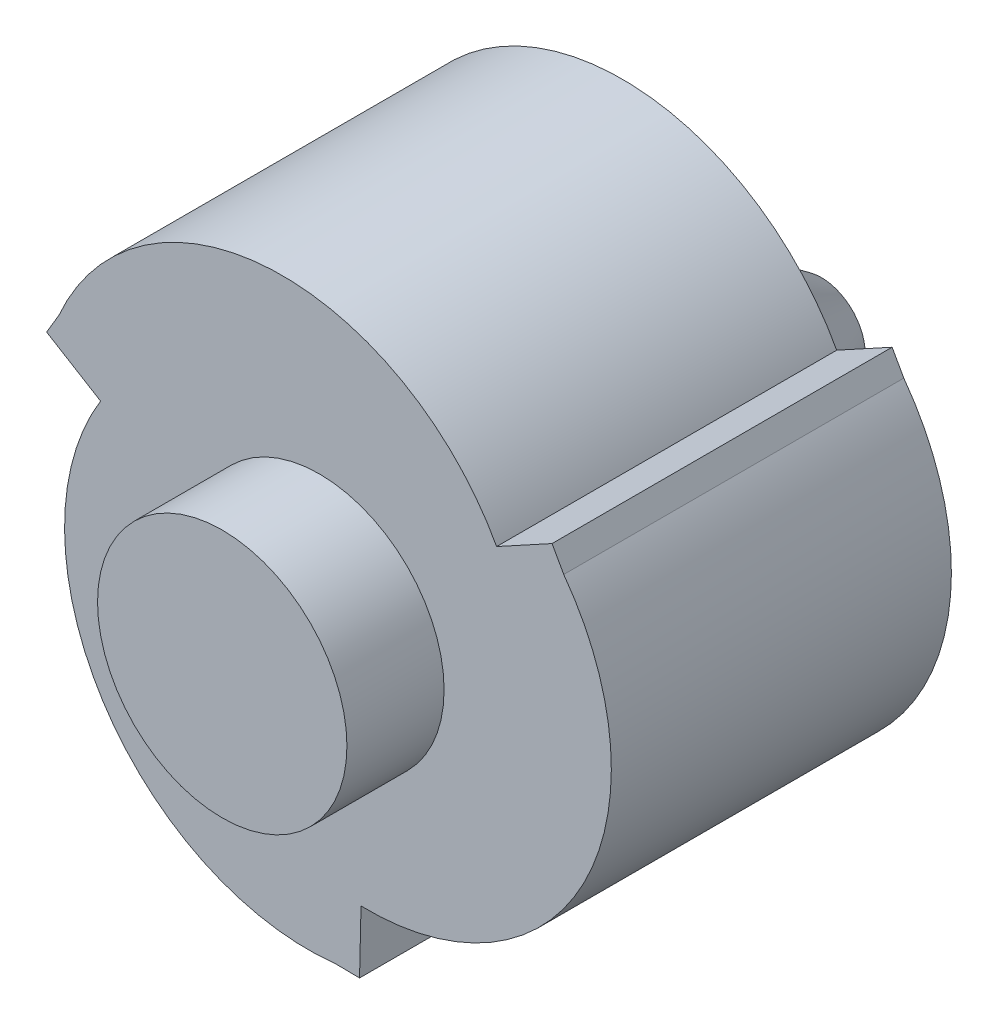
ISO-10303-21;
HEADER;
FILE_DESCRIPTION(('STEP AP214'),'2;1');
FILE_NAME('part.step','',(''),(''),'','','');
FILE_SCHEMA(('AUTOMOTIVE_DESIGN { 1 0 10303 214 1 1 1 1 }'));
ENDSEC;
DATA;
#1=APPLICATION_CONTEXT('core data for automotive mechanical design processes');
#2=APPLICATION_PROTOCOL_DEFINITION('international standard','automotive_design',2000,#1);
#3=PRODUCT_CONTEXT('',#1,'mechanical');
#4=PRODUCT('Part','Part','',(#3));
#5=PRODUCT_RELATED_PRODUCT_CATEGORY('part','',(#4));
#6=PRODUCT_DEFINITION_FORMATION('','',#4);
#7=PRODUCT_DEFINITION_CONTEXT('part definition',#1,'design');
#8=PRODUCT_DEFINITION('design','',#6,#7);
#9=PRODUCT_DEFINITION_SHAPE('','',#8);
#10=(LENGTH_UNIT() NAMED_UNIT(*) SI_UNIT(.MILLI.,.METRE.));
#11=(NAMED_UNIT(*) PLANE_ANGLE_UNIT() SI_UNIT($,.RADIAN.));
#12=(NAMED_UNIT(*) SI_UNIT($,.STERADIAN.) SOLID_ANGLE_UNIT());
#13=UNCERTAINTY_MEASURE_WITH_UNIT(LENGTH_MEASURE(1.E-05),#10,'distance_accuracy_value','');
#14=(GEOMETRIC_REPRESENTATION_CONTEXT(3) GLOBAL_UNCERTAINTY_ASSIGNED_CONTEXT((#13)) GLOBAL_UNIT_ASSIGNED_CONTEXT((#10,
#11,#12)) REPRESENTATION_CONTEXT('',''));
#15=CARTESIAN_POINT('',(0.,0.,0.));
#16=DIRECTION('',(0.,0.,1.));
#17=DIRECTION('',(1.,0.,0.));
#18=AXIS2_PLACEMENT_3D('',#15,#16,#17);
#19=CARTESIAN_POINT('',(-70.3006140847829,18.6401092386416,18.));
#20=DIRECTION('',(0.,0.,-1.));
#21=DIRECTION('',(-1.,0.,0.));
#22=AXIS2_PLACEMENT_3D('',#19,#20,#21);
#23=CYLINDRICAL_SURFACE('',#22,13.5393656771925);
#24=CARTESIAN_POINT('',(-70.3006140847829,18.6401092386416,0.));
#25=DIRECTION('',(0.,0.,1.));
#26=DIRECTION('',(-1.,0.,0.));
#27=AXIS2_PLACEMENT_3D('',#24,#25,#26);
#28=CIRCLE('',#27,13.5393656771925);
#29=CARTESIAN_POINT('',(-80.9495335990785,27.001624419444,0.));
#30=VERTEX_POINT('',#29);
#31=CARTESIAN_POINT('',(-69.6242160517726,5.11764982322154,0.));
#32=VERTEX_POINT('',#31);
#33=EDGE_CURVE('E196',#30,#32,#28,.T.);
#34=ORIENTED_EDGE('',*,*,#33,.F.);
#35=DIRECTION('',(0.,0.,-1.));
#36=VECTOR('',#35,1.);
#37=CARTESIAN_POINT('',(-80.9495335990785,27.001624419444,18.));
#38=LINE('',#37,#36);
#39=CARTESIAN_POINT('',(-80.9495335990785,27.001624419444,18.));
#40=VERTEX_POINT('',#39);
#41=EDGE_CURVE('E115',#40,#30,#38,.T.);
#42=ORIENTED_EDGE('',*,*,#41,.F.);
#43=CARTESIAN_POINT('',(-70.3006140847829,18.6401092386416,18.));
#44=DIRECTION('',(0.,0.,1.));
#45=DIRECTION('',(-1.,0.,0.));
#46=AXIS2_PLACEMENT_3D('',#43,#44,#45);
#47=CIRCLE('',#46,13.5393656771925);
#48=CARTESIAN_POINT('',(-69.6242160517726,5.11764982322154,18.));
#49=VERTEX_POINT('',#48);
#50=EDGE_CURVE('E49',#40,#49,#47,.T.);
#51=ORIENTED_EDGE('',*,*,#50,.T.);
#52=DIRECTION('',(0.,0.,-1.));
#53=VECTOR('',#52,1.);
#54=CARTESIAN_POINT('',(-69.6242160517726,5.11764982322154,18.));
#55=LINE('',#54,#53);
#56=EDGE_CURVE('E129',#49,#32,#55,.T.);
#57=ORIENTED_EDGE('',*,*,#56,.T.);
#58=EDGE_LOOP('',(#34,#42,#51,#57));
#59=FACE_BOUND('',#58,.T.);
#60=ADVANCED_FACE('F33',(#59),#23,.F.);
#61=CARTESIAN_POINT('',(-69.6242160517726,5.11764982322154,18.));
#62=DIRECTION('',(0.,1.,0.));
#63=DIRECTION('',(0.,0.,1.));
#64=AXIS2_PLACEMENT_3D('',#61,#62,#63);
#65=PLANE('',#64);
#66=DIRECTION('',(1.,0.,0.));
#67=VECTOR('',#66,1.);
#68=CARTESIAN_POINT('',(-69.6242160517726,5.11764982322154,0.));
#69=LINE('',#68,#67);
#70=CARTESIAN_POINT('',(-68.6242160517726,5.11764982322154,0.));
#71=VERTEX_POINT('',#70);
#72=EDGE_CURVE('E218',#32,#71,#69,.T.);
#73=ORIENTED_EDGE('',*,*,#72,.F.);
#74=ORIENTED_EDGE('',*,*,#56,.F.);
#75=DIRECTION('',(1.,0.,0.));
#76=VECTOR('',#75,1.);
#77=CARTESIAN_POINT('',(-69.6242160517726,5.11764982322154,18.));
#78=LINE('',#77,#76);
#79=CARTESIAN_POINT('',(-68.6242160517726,5.11764982322154,18.));
#80=VERTEX_POINT('',#79);
#81=EDGE_CURVE('E198',#49,#80,#78,.T.);
#82=ORIENTED_EDGE('',*,*,#81,.T.);
#83=DIRECTION('',(0.,0.,-1.));
#84=VECTOR('',#83,1.);
#85=CARTESIAN_POINT('',(-68.6242160517726,5.11764982322154,18.));
#86=LINE('',#85,#84);
#87=EDGE_CURVE('E127',#80,#71,#86,.T.);
#88=ORIENTED_EDGE('',*,*,#87,.T.);
#89=EDGE_LOOP('',(#73,#74,#82,#88));
#90=FACE_BOUND('',#89,.T.);
#91=ADVANCED_FACE('F279',(#90),#65,.T.);
#92=CARTESIAN_POINT('',(-68.6242160517726,5.11764982322154,18.));
#93=DIRECTION('',(-1.,0.,0.));
#94=DIRECTION('',(0.,0.,1.));
#95=AXIS2_PLACEMENT_3D('',#92,#93,#94);
#96=PLANE('',#95);
#97=DIRECTION('',(0.,1.,0.));
#98=VECTOR('',#97,1.);
#99=CARTESIAN_POINT('',(-68.6242160517726,5.11764982322154,0.));
#100=LINE('',#99,#98);
#101=CARTESIAN_POINT('',(-68.6242160517726,9.11764982322154,0.));
#102=VERTEX_POINT('',#101);
#103=EDGE_CURVE('E221',#71,#102,#100,.T.);
#104=ORIENTED_EDGE('',*,*,#103,.F.);
#105=ORIENTED_EDGE('',*,*,#87,.F.);
#106=DIRECTION('',(0.,1.,0.));
#107=VECTOR('',#106,1.);
#108=CARTESIAN_POINT('',(-68.6242160517726,5.11764982322154,18.));
#109=LINE('',#108,#107);
#110=CARTESIAN_POINT('',(-68.6242160517726,9.11764982322156,18.));
#111=VERTEX_POINT('',#110);
#112=EDGE_CURVE('E201',#80,#111,#109,.T.);
#113=ORIENTED_EDGE('',*,*,#112,.T.);
#114=DIRECTION('',(0.,0.,-1.));
#115=VECTOR('',#114,1.);
#116=CARTESIAN_POINT('',(-68.6242160517726,9.11764982322154,18.));
#117=LINE('',#116,#115);
#118=EDGE_CURVE('E125',#111,#102,#117,.T.);
#119=ORIENTED_EDGE('',*,*,#118,.T.);
#120=EDGE_LOOP('',(#104,#105,#113,#119));
#121=FACE_BOUND('',#120,.T.);
#122=ADVANCED_FACE('F282',(#121),#96,.T.);
#123=CARTESIAN_POINT('',(-66.707391248216,22.5206422358586,18.));
#124=DIRECTION('',(0.,0.,-1.));
#125=DIRECTION('',(-1.,0.,0.));
#126=AXIS2_PLACEMENT_3D('',#123,#124,#125);
#127=CYLINDRICAL_SURFACE('',#126,13.5393656771924);
#128=CARTESIAN_POINT('',(-66.707391248216,22.5206422358586,0.));
#129=DIRECTION('',(0.,0.,1.));
#130=DIRECTION('',(-1.,0.,0.));
#131=AXIS2_PLACEMENT_3D('',#128,#129,#130);
#132=CIRCLE('',#131,13.5393656771924);
#133=CARTESIAN_POINT('',(-55.3347968893236,29.8676498232254,0.));
#134=VERTEX_POINT('',#133);
#135=EDGE_CURVE('E224',#102,#134,#132,.T.);
#136=ORIENTED_EDGE('',*,*,#135,.F.);
#137=ORIENTED_EDGE('',*,*,#118,.F.);
#138=CARTESIAN_POINT('',(-66.707391248216,22.5206422358586,18.));
#139=DIRECTION('',(0.,0.,1.));
#140=DIRECTION('',(-1.,0.,0.));
#141=AXIS2_PLACEMENT_3D('',#138,#139,#140);
#142=CIRCLE('',#141,13.5393656771924);
#143=CARTESIAN_POINT('',(-55.3347968893237,29.8676498232254,18.));
#144=VERTEX_POINT('',#143);
#145=EDGE_CURVE('E204',#111,#144,#142,.T.);
#146=ORIENTED_EDGE('',*,*,#145,.T.);
#147=DIRECTION('',(0.,0.,-1.));
#148=VECTOR('',#147,1.);
#149=CARTESIAN_POINT('',(-55.3347968893236,29.8676498232254,18.));
#150=LINE('',#149,#148);
#151=EDGE_CURVE('E123',#144,#134,#150,.T.);
#152=ORIENTED_EDGE('',*,*,#151,.T.);
#153=EDGE_LOOP('',(#136,#137,#146,#152));
#154=FACE_BOUND('',#153,.T.);
#155=ADVANCED_FACE('F285',(#154),#127,.F.);
#156=CARTESIAN_POINT('',(-55.3347968893236,29.8676498232254,18.));
#157=DIRECTION('',(-0.866025403784449,-0.499999999999981,0.));
#158=DIRECTION('',(0.499999999999981,-0.866025403784449,0.));
#159=AXIS2_PLACEMENT_3D('',#156,#157,#158);
#160=PLANE('',#159);
#161=DIRECTION('',(-0.499999999999981,0.866025403784449,0.));
#162=VECTOR('',#161,1.);
#163=CARTESIAN_POINT('',(-55.3347968893236,29.8676498232254,0.));
#164=LINE('',#163,#162);
#165=CARTESIAN_POINT('',(-55.8347968893236,30.7336752270098,0.));
#166=VERTEX_POINT('',#165);
#167=EDGE_CURVE('E110',#134,#166,#164,.T.);
#168=ORIENTED_EDGE('',*,*,#167,.F.);
#169=ORIENTED_EDGE('',*,*,#151,.F.);
#170=DIRECTION('',(-0.499999999999981,0.866025403784449,0.));
#171=VECTOR('',#170,1.);
#172=CARTESIAN_POINT('',(-55.3347968893236,29.8676498232254,18.));
#173=LINE('',#172,#171);
#174=CARTESIAN_POINT('',(-55.8347968893236,30.7336752270098,18.));
#175=VERTEX_POINT('',#174);
#176=EDGE_CURVE('E207',#144,#175,#173,.T.);
#177=ORIENTED_EDGE('',*,*,#176,.T.);
#178=DIRECTION('',(0.,0.,-1.));
#179=VECTOR('',#178,1.);
#180=CARTESIAN_POINT('',(-55.8347968893236,30.7336752270098,18.));
#181=LINE('',#180,#179);
#182=EDGE_CURVE('E121',#175,#166,#181,.T.);
#183=ORIENTED_EDGE('',*,*,#182,.T.);
#184=EDGE_LOOP('',(#168,#169,#177,#183));
#185=FACE_BOUND('',#184,.T.);
#186=ADVANCED_FACE('F230',(#185),#160,.T.);
#187=CARTESIAN_POINT('',(-55.8347968893236,30.7336752270098,18.));
#188=DIRECTION('',(0.500000000000001,-0.866025403784438,0.));
#189=DIRECTION('',(0.866025403784438,0.500000000000001,0.));
#190=AXIS2_PLACEMENT_3D('',#187,#188,#189);
#191=PLANE('',#190);
#192=DIRECTION('',(-0.866025403784438,-0.500000000000001,0.));
#193=VECTOR('',#192,1.);
#194=CARTESIAN_POINT('',(-55.8347968893236,30.7336752270098,0.));
#195=LINE('',#194,#193);
#196=CARTESIAN_POINT('',(-59.2988985044614,28.7336752270098,0.));
#197=VERTEX_POINT('',#196);
#198=EDGE_CURVE('E108',#166,#197,#195,.T.);
#199=ORIENTED_EDGE('',*,*,#198,.F.);
#200=ORIENTED_EDGE('',*,*,#182,.F.);
#201=DIRECTION('',(-0.866025403784438,-0.500000000000001,0.));
#202=VECTOR('',#201,1.);
#203=CARTESIAN_POINT('',(-55.8347968893236,30.7336752270098,18.));
#204=LINE('',#203,#202);
#205=CARTESIAN_POINT('',(-59.2988985044614,28.7336752270098,18.));
#206=VERTEX_POINT('',#205);
#207=EDGE_CURVE('E210',#175,#206,#204,.T.);
#208=ORIENTED_EDGE('',*,*,#207,.T.);
#209=DIRECTION('',(0.,0.,-1.));
#210=VECTOR('',#209,1.);
#211=CARTESIAN_POINT('',(-59.2988985044614,28.7336752270098,18.));
#212=LINE('',#211,#210);
#213=EDGE_CURVE('E91',#206,#197,#212,.T.);
#214=ORIENTED_EDGE('',*,*,#213,.T.);
#215=EDGE_LOOP('',(#199,#200,#208,#214));
#216=FACE_BOUND('',#215,.T.);
#217=ADVANCED_FACE('F236',(#216),#191,.T.);
#218=CARTESIAN_POINT('',(-71.8646428223134,23.6921979951755,18.));
#219=DIRECTION('',(0.,0.,-1.));
#220=DIRECTION('',(-1.,0.,0.));
#221=AXIS2_PLACEMENT_3D('',#218,#219,#220);
#222=CYLINDRICAL_SURFACE('',#221,13.5393656771924);
#223=CARTESIAN_POINT('',(-71.8646428223134,23.6921979951755,0.));
#224=DIRECTION('',(0.,0.,1.));
#225=DIRECTION('',(-1.,0.,0.));
#226=AXIS2_PLACEMENT_3D('',#223,#224,#225);
#227=CIRCLE('',#226,13.5393656771924);
#228=CARTESIAN_POINT('',(-83.9136352142163,29.8676498232284,0.));
#229=VERTEX_POINT('',#228);
#230=EDGE_CURVE('E84',#197,#229,#227,.T.);
#231=ORIENTED_EDGE('',*,*,#230,.F.);
#232=ORIENTED_EDGE('',*,*,#213,.F.);
#233=CARTESIAN_POINT('',(-71.8646428223134,23.6921979951755,18.));
#234=DIRECTION('',(0.,0.,1.));
#235=DIRECTION('',(-1.,0.,0.));
#236=AXIS2_PLACEMENT_3D('',#233,#234,#235);
#237=CIRCLE('',#236,13.5393656771924);
#238=CARTESIAN_POINT('',(-83.9136352142163,29.8676498232284,18.));
#239=VERTEX_POINT('',#238);
#240=EDGE_CURVE('E88',#206,#239,#237,.T.);
#241=ORIENTED_EDGE('',*,*,#240,.T.);
#242=DIRECTION('',(0.,0.,-1.));
#243=VECTOR('',#242,1.);
#244=CARTESIAN_POINT('',(-83.9136352142163,29.8676498232284,18.));
#245=LINE('',#244,#243);
#246=EDGE_CURVE('E79',#239,#229,#245,.T.);
#247=ORIENTED_EDGE('',*,*,#246,.T.);
#248=EDGE_LOOP('',(#231,#232,#241,#247));
#249=FACE_BOUND('',#248,.T.);
#250=ADVANCED_FACE('F81',(#249),#222,.F.);
#251=CARTESIAN_POINT('',(-83.9136352142163,29.8676498232284,18.));
#252=DIRECTION('',(0.866025403784439,-0.499999999999998,0.));
#253=DIRECTION('',(0.499999999999999,0.86602540378444,0.));
#254=AXIS2_PLACEMENT_3D('',#251,#252,#253);
#255=PLANE('',#254);
#256=DIRECTION('',(-0.499999999999998,-0.866025403784439,0.));
#257=VECTOR('',#256,1.);
#258=CARTESIAN_POINT('',(-83.9136352142163,29.8676498232284,0.));
#259=LINE('',#258,#257);
#260=CARTESIAN_POINT('',(-84.4136352142163,29.001624419444,0.));
#261=VERTEX_POINT('',#260);
#262=EDGE_CURVE('E95',#229,#261,#259,.T.);
#263=ORIENTED_EDGE('',*,*,#262,.F.);
#264=ORIENTED_EDGE('',*,*,#246,.F.);
#265=DIRECTION('',(-0.499999999999998,-0.866025403784439,0.));
#266=VECTOR('',#265,1.);
#267=CARTESIAN_POINT('',(-83.9136352142163,29.8676498232284,18.));
#268=LINE('',#267,#266);
#269=CARTESIAN_POINT('',(-84.4136352142163,29.001624419444,18.));
#270=VERTEX_POINT('',#269);
#271=EDGE_CURVE('E214',#239,#270,#268,.T.);
#272=ORIENTED_EDGE('',*,*,#271,.T.);
#273=DIRECTION('',(0.,0.,-1.));
#274=VECTOR('',#273,1.);
#275=CARTESIAN_POINT('',(-84.4136352142163,29.001624419444,18.));
#276=LINE('',#275,#274);
#277=EDGE_CURVE('E92',#270,#261,#276,.T.);
#278=ORIENTED_EDGE('',*,*,#277,.T.);
#279=EDGE_LOOP('',(#263,#264,#272,#278));
#280=FACE_BOUND('',#279,.T.);
#281=ADVANCED_FACE('F96',(#280),#255,.T.);
#282=CARTESIAN_POINT('',(-84.4136352142163,29.001624419444,18.));
#283=DIRECTION('',(0.500000000000001,0.866025403784438,0.));
#284=DIRECTION('',(-0.866025403784438,0.500000000000001,0.));
#285=AXIS2_PLACEMENT_3D('',#282,#283,#284);
#286=PLANE('',#285);
#287=DIRECTION('',(0.866025403784438,-0.500000000000001,0.));
#288=VECTOR('',#287,1.);
#289=CARTESIAN_POINT('',(-84.4136352142163,29.001624419444,0.));
#290=LINE('',#289,#288);
#291=EDGE_CURVE('E101',#261,#30,#290,.T.);
#292=ORIENTED_EDGE('',*,*,#291,.F.);
#293=ORIENTED_EDGE('',*,*,#277,.F.);
#294=DIRECTION('',(0.866025403784438,-0.500000000000001,0.));
#295=VECTOR('',#294,1.);
#296=CARTESIAN_POINT('',(-84.4136352142163,29.001624419444,18.));
#297=LINE('',#296,#295);
#298=EDGE_CURVE('E118',#270,#40,#297,.T.);
#299=ORIENTED_EDGE('',*,*,#298,.T.);
#300=ORIENTED_EDGE('',*,*,#41,.T.);
#301=EDGE_LOOP('',(#292,#293,#299,#300));
#302=FACE_BOUND('',#301,.T.);
#303=ADVANCED_FACE('F274',(#302),#286,.T.);
#304=CARTESIAN_POINT('',(-66.6533771820385,22.5473544654885,0.));
#305=DIRECTION('',(0.,0.,-1.));
#306=DIRECTION('',(-1.,0.,0.));
#307=AXIS2_PLACEMENT_3D('',#304,#305,#306);
#308=PLANE('',#307);
#309=ORIENTED_EDGE('',*,*,#33,.T.);
#310=ORIENTED_EDGE('',*,*,#72,.T.);
#311=ORIENTED_EDGE('',*,*,#103,.T.);
#312=ORIENTED_EDGE('',*,*,#135,.T.);
#313=ORIENTED_EDGE('',*,*,#167,.T.);
#314=ORIENTED_EDGE('',*,*,#198,.T.);
#315=ORIENTED_EDGE('',*,*,#230,.T.);
#316=ORIENTED_EDGE('',*,*,#262,.T.);
#317=ORIENTED_EDGE('',*,*,#291,.T.);
#318=EDGE_LOOP('',(#309,#310,#311,#312,#313,#314,#315,#316,#317));
#319=FACE_BOUND('',#318,.T.);
#320=CARTESIAN_POINT('',(-69.6242160517709,21.6176498232251,0.));
#321=DIRECTION('',(0.,0.,-1.));
#322=DIRECTION('',(-1.,0.,0.));
#323=AXIS2_PLACEMENT_3D('',#320,#321,#322);
#324=CIRCLE('',#323,2.7);
#325=CARTESIAN_POINT('',(-72.3242160517708,21.6176498232251,0.));
#326=VERTEX_POINT('',#325);
#327=EDGE_CURVE('E603',#326,#326,#324,.T.);
#328=ORIENTED_EDGE('',*,*,#327,.T.);
#329=EDGE_LOOP('',(#328));
#330=FACE_BOUND('',#329,.T.);
#331=ADVANCED_FACE('F104',(#319,#330),#308,.F.);
#332=CARTESIAN_POINT('',(-69.6242160517709,21.6176498232251,-1.5));
#333=DIRECTION('',(0.,0.,1.));
#334=DIRECTION('',(1.,0.,0.));
#335=AXIS2_PLACEMENT_3D('',#332,#333,#334);
#336=CYLINDRICAL_SURFACE('',#335,2.7);
#337=ORIENTED_EDGE('',*,*,#327,.F.);
#338=EDGE_LOOP('',(#337));
#339=FACE_BOUND('',#338,.T.);
#340=CARTESIAN_POINT('',(-69.6242160517709,21.6176498232251,-11.5));
#341=DIRECTION('',(0.,0.,-1.));
#342=DIRECTION('',(-1.,0.,0.));
#343=AXIS2_PLACEMENT_3D('',#340,#341,#342);
#344=CIRCLE('',#343,2.69999999999999);
#345=CARTESIAN_POINT('',(-66.9242160517709,21.6176498232251,-11.5));
#346=VERTEX_POINT('',#345);
#347=EDGE_CURVE('E574',#346,#346,#344,.T.);
#348=ORIENTED_EDGE('',*,*,#347,.T.);
#349=EDGE_LOOP('',(#348));
#350=FACE_BOUND('',#349,.T.);
#351=ADVANCED_FACE('F289',(#339,#350),#336,.F.);
#352=CARTESIAN_POINT('',(-66.6533771820343,22.5473544654863,18.));
#353=DIRECTION('',(0.,0.,-1.));
#354=DIRECTION('',(-1.,0.,0.));
#355=AXIS2_PLACEMENT_3D('',#352,#353,#354);
#356=PLANE('',#355);
#357=ORIENTED_EDGE('',*,*,#81,.F.);
#358=ORIENTED_EDGE('',*,*,#50,.F.);
#359=ORIENTED_EDGE('',*,*,#298,.F.);
#360=ORIENTED_EDGE('',*,*,#271,.F.);
#361=ORIENTED_EDGE('',*,*,#240,.F.);
#362=ORIENTED_EDGE('',*,*,#207,.F.);
#363=ORIENTED_EDGE('',*,*,#176,.F.);
#364=ORIENTED_EDGE('',*,*,#145,.F.);
#365=ORIENTED_EDGE('',*,*,#112,.F.);
#366=EDGE_LOOP('',(#357,#358,#359,#360,#361,#362,#363,#364,#365));
#367=FACE_BOUND('',#366,.T.);
#368=ADVANCED_FACE('F286',(#367),#356,.T.);
#369=CARTESIAN_POINT('',(-69.6242160517709,21.6176498232251,-11.5));
#370=DIRECTION('',(0.,0.,1.));
#371=DIRECTION('',(1.,0.,0.));
#372=AXIS2_PLACEMENT_3D('',#369,#370,#371);
#373=CONICAL_SURFACE('',#372,2.69999999999999,0.621553291736453);
#374=CARTESIAN_POINT('',(-69.6242160517709,21.6176498232251,-1.5));
#375=DIRECTION('',(0.,0.,-1.));
#376=DIRECTION('',(-1.,0.,0.));
#377=AXIS2_PLACEMENT_3D('',#374,#375,#376);
#378=CIRCLE('',#377,9.86256563605176);
#379=CARTESIAN_POINT('',(-59.7616504157191,21.6176498232251,-1.5));
#380=VERTEX_POINT('',#379);
#381=EDGE_CURVE('E11',#380,#380,#378,.T.);
#382=CARTESIAN_POINT('',(-59.7616504157191,21.6176498232251,-1.5));
#383=CARTESIAN_POINT('',(-59.836260474428,21.6176498232251,-1.60416666666666));
#384=CARTESIAN_POINT('',(-59.9108705331368,21.6176498232251,-1.70833333333333));
#385=CARTESIAN_POINT('',(-60.0600906505546,21.6176498232251,-1.91666666666666));
#386=CARTESIAN_POINT('',(-60.1347007092635,21.6176498232251,-2.02083333333333));
#387=CARTESIAN_POINT('',(-60.2839208266812,21.6176498232251,-2.22916666666667));
#388=CARTESIAN_POINT('',(-60.3585308853901,21.6176498232251,-2.33333333333333));
#389=CARTESIAN_POINT('',(-60.5077510028078,21.6176498232251,-2.54166666666667));
#390=CARTESIAN_POINT('',(-60.5823610615167,21.6176498232251,-2.64583333333333));
#391=CARTESIAN_POINT('',(-60.7315811789344,21.6176498232251,-2.85416666666666));
#392=CARTESIAN_POINT('',(-60.8061912376433,21.6176498232251,-2.95833333333333));
#393=CARTESIAN_POINT('',(-60.9554113550611,21.6176498232251,-3.16666666666666));
#394=CARTESIAN_POINT('',(-61.0300214137699,21.6176498232251,-3.27083333333333));
#395=CARTESIAN_POINT('',(-61.1792415311877,21.6176498232251,-3.47916666666667));
#396=CARTESIAN_POINT('',(-61.2538515898965,21.6176498232251,-3.58333333333333));
#397=CARTESIAN_POINT('',(-61.4030717073143,21.6176498232251,-3.79166666666666));
#398=CARTESIAN_POINT('',(-61.4776817660232,21.6176498232251,-3.89583333333333));
#399=CARTESIAN_POINT('',(-61.6269018834409,21.6176498232251,-4.10416666666666));
#400=CARTESIAN_POINT('',(-61.7015119421498,21.6176498232251,-4.20833333333333));
#401=CARTESIAN_POINT('',(-61.8507320595675,21.6176498232251,-4.41666666666667));
#402=CARTESIAN_POINT('',(-61.9253421182764,21.6176498232251,-4.52083333333333));
#403=CARTESIAN_POINT('',(-62.0745622356941,21.6176498232251,-4.72916666666667));
#404=CARTESIAN_POINT('',(-62.149172294403,21.6176498232251,-4.83333333333333));
#405=CARTESIAN_POINT('',(-62.2983924118208,21.6176498232251,-5.04166666666666));
#406=CARTESIAN_POINT('',(-62.3730024705296,21.6176498232251,-5.14583333333333));
#407=CARTESIAN_POINT('',(-62.5222225879474,21.6176498232251,-5.35416666666667));
#408=CARTESIAN_POINT('',(-62.5968326466562,21.6176498232251,-5.45833333333333));
#409=CARTESIAN_POINT('',(-62.746052764074,21.6176498232251,-5.66666666666667));
#410=CARTESIAN_POINT('',(-62.8206628227829,21.6176498232251,-5.77083333333333));
#411=CARTESIAN_POINT('',(-62.9698829402006,21.6176498232251,-5.97916666666667));
#412=CARTESIAN_POINT('',(-63.0444929989095,21.6176498232251,-6.08333333333333));
#413=CARTESIAN_POINT('',(-63.1937131163272,21.6176498232251,-6.29166666666666));
#414=CARTESIAN_POINT('',(-63.2683231750361,21.6176498232251,-6.39583333333333));
#415=CARTESIAN_POINT('',(-63.4175432924539,21.6176498232251,-6.60416666666666));
#416=CARTESIAN_POINT('',(-63.4921533511627,21.6176498232251,-6.70833333333333));
#417=CARTESIAN_POINT('',(-63.6413734685805,21.6176498232251,-6.91666666666667));
#418=CARTESIAN_POINT('',(-63.7159835272893,21.6176498232251,-7.02083333333333));
#419=CARTESIAN_POINT('',(-63.8652036447071,21.6176498232251,-7.22916666666666));
#420=CARTESIAN_POINT('',(-63.939813703416,21.6176498232251,-7.33333333333333));
#421=CARTESIAN_POINT('',(-64.0890338208337,21.6176498232251,-7.54166666666666));
#422=CARTESIAN_POINT('',(-64.1636438795426,21.6176498232251,-7.64583333333333));
#423=CARTESIAN_POINT('',(-64.3128639969603,21.6176498232251,-7.85416666666667));
#424=CARTESIAN_POINT('',(-64.3874740556692,21.6176498232251,-7.95833333333333));
#425=CARTESIAN_POINT('',(-64.5366941730869,21.6176498232251,-8.16666666666666));
#426=CARTESIAN_POINT('',(-64.6113042317958,21.6176498232251,-8.27083333333333));
#427=CARTESIAN_POINT('',(-64.7605243492136,21.6176498232251,-8.47916666666666));
#428=CARTESIAN_POINT('',(-64.8351344079224,21.6176498232251,-8.58333333333333));
#429=CARTESIAN_POINT('',(-64.9843545253402,21.6176498232251,-8.79166666666666));
#430=CARTESIAN_POINT('',(-65.058964584049,21.6176498232251,-8.89583333333333));
#431=CARTESIAN_POINT('',(-65.2081847014668,21.6176498232251,-9.10416666666667));
#432=CARTESIAN_POINT('',(-65.2827947601757,21.6176498232251,-9.20833333333333));
#433=CARTESIAN_POINT('',(-65.4320148775934,21.6176498232251,-9.41666666666666));
#434=CARTESIAN_POINT('',(-65.5066249363023,21.6176498232251,-9.52083333333333));
#435=CARTESIAN_POINT('',(-65.65584505372,21.6176498232251,-9.72916666666666));
#436=CARTESIAN_POINT('',(-65.7304551124289,21.6176498232251,-9.83333333333333));
#437=CARTESIAN_POINT('',(-65.8796752298466,21.6176498232251,-10.0416666666667));
#438=CARTESIAN_POINT('',(-65.9542852885555,21.6176498232251,-10.1458333333333));
#439=CARTESIAN_POINT('',(-66.1035054059733,21.6176498232251,-10.3541666666667));
#440=CARTESIAN_POINT('',(-66.1781154646821,21.6176498232251,-10.4583333333333));
#441=CARTESIAN_POINT('',(-66.3273355820999,21.6176498232251,-10.6666666666667));
#442=CARTESIAN_POINT('',(-66.4019456408087,21.6176498232251,-10.7708333333333));
#443=CARTESIAN_POINT('',(-66.5511657582265,21.6176498232251,-10.9791666666667));
#444=CARTESIAN_POINT('',(-66.6257758169354,21.6176498232251,-11.0833333333333));
#445=CARTESIAN_POINT('',(-66.7749959343531,21.6176498232251,-11.2916666666667));
#446=CARTESIAN_POINT('',(-66.849605993062,21.6176498232251,-11.3958333333333));
#447=CARTESIAN_POINT('',(-66.9242160517709,21.6176498232251,-11.5));
#448=B_SPLINE_CURVE_WITH_KNOTS('',3,(#382,#383,#384,#385,#386,#387,#388,#389,#390,#391,#392,
#393,#394,#395,#396,#397,#398,#399,#400,#401,#402,#403,#404,#405,#406,#407,#408,#409,#410,#411,
#412,#413,#414,#415,#416,#417,#418,#419,#420,#421,#422,#423,#424,#425,#426,#427,#428,#429,#430,
#431,#432,#433,#434,#435,#436,#437,#438,#439,#440,#441,#442,#443,#444,#445,#446,#447),
.UNSPECIFIED.,.F.,.F.,(4,2,2,2,2,2,2,2,2,2,2,2,2,2,2,2,2,2,2,2,2,2,2,2,2,2,2,2,2,2,2,2,4),(0.,
0.3843906837384,0.768781367476796,1.15317205121519,1.53756273495359,1.92195341869199,
2.30634410243038,2.69073478616878,3.07512546990718,3.45951615364558,3.84390683738397,
4.22829752112237,4.61268820486077,4.99707888859916,5.38146957233756,5.76586025607596,
6.15025093981436,6.53464162355275,6.91903230729115,7.30342299102955,7.68781367476795,
8.07220435850634,8.45659504224474,8.84098572598314,9.22537640972154,9.60976709345993,
9.99415777719833,10.3785484609367,10.7629391446751,11.1473298284135,11.5317205121519,
11.9161111958903,12.3005018796287),.UNSPECIFIED.);
#449=EDGE_CURVE('BSEAM288',#380,#346,#448,.T.);
#450=ORIENTED_EDGE('',*,*,#381,.T.);
#451=ORIENTED_EDGE('',*,*,#347,.F.);
#452=ORIENTED_EDGE('',*,*,#449,.T.);
#453=ORIENTED_EDGE('',*,*,#449,.F.);
#454=EDGE_LOOP('',(#450,#452,#451,#453));
#455=FACE_BOUND('',#454,.T.);
#456=ADVANCED_FACE('F288',(#455),#373,.T.);
#457=CARTESIAN_POINT('',(-66.6533771820343,22.5473544654863,19.5));
#458=DIRECTION('',(0.,0.,-1.));
#459=DIRECTION('',(-1.,0.,0.));
#460=AXIS2_PLACEMENT_3D('',#457,#458,#459);
#461=PLANE('',#460);
#462=CARTESIAN_POINT('',(-69.6242160517709,21.6176498232251,19.5));
#463=DIRECTION('',(0.,0.,-1.));
#464=DIRECTION('',(-1.,0.,0.));
#465=AXIS2_PLACEMENT_3D('',#462,#463,#464);
#466=CIRCLE('',#465,7.7);
#467=CARTESIAN_POINT('',(-77.3242160517708,21.6176498232251,19.5));
#468=VERTEX_POINT('',#467);
#469=EDGE_CURVE('E572',#468,#468,#466,.T.);
#470=ORIENTED_EDGE('',*,*,#469,.T.);
#471=EDGE_LOOP('',(#470));
#472=FACE_BOUND('',#471,.T.);
#473=CARTESIAN_POINT('',(-66.6533771820343,22.5473544654863,19.5));
#474=DIRECTION('',(0.,0.,1.));
#475=DIRECTION('',(-1.,0.,0.));
#476=AXIS2_PLACEMENT_3D('',#473,#474,#475);
#477=CIRCLE('',#476,15.056377532513);
#478=CARTESIAN_POINT('',(-67.0546580766655,7.49632532973726,19.5));
#479=VERTEX_POINT('',#478);
#480=CARTESIAN_POINT('',(-54.5350991143393,31.4827806486958,19.5));
#481=VERTEX_POINT('',#480);
#482=EDGE_CURVE('E579',#479,#481,#477,.T.);
#483=ORIENTED_EDGE('',*,*,#482,.T.);
#484=DIRECTION('',(-0.488162912485753,0.872752525561185,0.));
#485=VECTOR('',#484,1.);
#486=CARTESIAN_POINT('',(-55.257912469717,32.7750483840772,19.5));
#487=LINE('',#486,#485);
#488=CARTESIAN_POINT('',(-55.257912469717,32.7750483840772,19.5));
#489=VERTEX_POINT('',#488);
#490=EDGE_CURVE('E582',#481,#489,#487,.T.);
#491=ORIENTED_EDGE('',*,*,#490,.T.);
#492=DIRECTION('',(-0.877347903376607,-0.479854828506156,0.));
#493=VECTOR('',#492,1.);
#494=CARTESIAN_POINT('',(-55.257912469717,32.7750483840772,19.5));
#495=LINE('',#494,#493);
#496=CARTESIAN_POINT('',(-58.6795692928855,30.9036145529034,19.5));
#497=VERTEX_POINT('',#496);
#498=EDGE_CURVE('E585',#489,#497,#495,.T.);
#499=ORIENTED_EDGE('',*,*,#498,.T.);
#500=CARTESIAN_POINT('',(-71.9147833248595,23.7256194338327,19.5));
#501=DIRECTION('',(0.,0.,1.));
#502=DIRECTION('',(-1.,0.,0.));
#503=AXIS2_PLACEMENT_3D('',#500,#501,#502);
#504=CIRCLE('',#503,15.056377532513);
#505=CARTESIAN_POINT('',(-85.712228427007,29.7526429989757,19.5));
#506=VERTEX_POINT('',#505);
#507=EDGE_CURVE('E588',#497,#506,#504,.T.);
#508=ORIENTED_EDGE('',*,*,#507,.T.);
#509=DIRECTION('',(-0.511744402110139,-0.859137746178653,0.));
#510=VECTOR('',#509,1.);
#511=CARTESIAN_POINT('',(-86.4699584366495,28.4805344033332,19.5));
#512=LINE('',#511,#510);
#513=CARTESIAN_POINT('',(-86.4699584366495,28.4805344033332,19.5));
#514=VERTEX_POINT('',#513);
#515=EDGE_CURVE('E168',#506,#514,#512,.T.);
#516=ORIENTED_EDGE('',*,*,#515,.T.);
#517=DIRECTION('',(0.85424042330326,-0.519878158028078,0.));
#518=VECTOR('',#517,1.);
#519=CARTESIAN_POINT('',(-86.4699584366495,28.4805344033332,19.5));
#520=LINE('',#519,#518);
#521=CARTESIAN_POINT('',(-83.138420785767,26.4530095870239,19.5));
#522=VERTEX_POINT('',#521);
#523=EDGE_CURVE('E591',#514,#522,#520,.T.);
#524=ORIENTED_EDGE('',*,*,#523,.T.);
#525=CARTESIAN_POINT('',(-70.3044876484241,18.5799755703455,19.5));
#526=DIRECTION('',(0.,0.,1.));
#527=DIRECTION('',(-1.,0.,0.));
#528=AXIS2_PLACEMENT_3D('',#525,#526,#527);
#529=CIRCLE('',#528,15.056377532513);
#530=CARTESIAN_POINT('',(-68.6253206139717,3.61752582199304,19.5));
#531=VERTEX_POINT('',#530);
#532=EDGE_CURVE('E594',#522,#531,#529,.T.);
#533=ORIENTED_EDGE('',*,*,#532,.T.);
#534=DIRECTION('',(0.99990731459589,-0.0136147793825315,0.));
#535=VECTOR('',#534,1.);
#536=CARTESIAN_POINT('',(-67.1447772489515,3.59736668225401,19.5));
#537=LINE('',#536,#535);
#538=CARTESIAN_POINT('',(-67.1447772489515,3.59736668225401,19.5));
#539=VERTEX_POINT('',#538);
#540=EDGE_CURVE('E597',#531,#539,#537,.T.);
#541=ORIENTED_EDGE('',*,*,#540,.T.);
#542=DIRECTION('',(0.0231074800733432,0.999732986534235,0.));
#543=VECTOR('',#542,1.);
#544=CARTESIAN_POINT('',(-67.1447772489515,3.59736668225401,19.5));
#545=LINE('',#544,#543);
#546=EDGE_CURVE('E600',#539,#479,#545,.T.);
#547=ORIENTED_EDGE('',*,*,#546,.T.);
#548=EDGE_LOOP('',(#483,#491,#499,#508,#516,#524,#533,#541,#547));
#549=FACE_BOUND('',#548,.T.);
#550=ADVANCED_FACE('F295',(#472,#549),#461,.F.);
#551=CARTESIAN_POINT('',(-54.5350991143392,31.4827806486958,18.));
#552=DIRECTION('',(-0.872752525561191,-0.488162912485742,0.));
#553=DIRECTION('',(0.488162912485742,-0.872752525561191,0.));
#554=AXIS2_PLACEMENT_3D('',#551,#552,#553);
#555=PLANE('',#554);
#556=DIRECTION('',(0.,0.,-1.));
#557=VECTOR('',#556,1.);
#558=CARTESIAN_POINT('',(-54.5350991143392,31.4827806486958,18.));
#559=LINE('',#558,#557);
#560=CARTESIAN_POINT('',(-54.5350991143393,31.4827806486958,-1.5));
#561=VERTEX_POINT('',#560);
#562=EDGE_CURVE('E138',#481,#561,#559,.T.);
#563=ORIENTED_EDGE('',*,*,#562,.T.);
#564=DIRECTION('',(0.488162912485753,-0.872752525561185,0.));
#565=VECTOR('',#564,1.);
#566=CARTESIAN_POINT('',(-55.257912469717,32.7750483840772,-1.5));
#567=LINE('',#566,#565);
#568=CARTESIAN_POINT('',(-55.257912469717,32.7750483840772,-1.5));
#569=VERTEX_POINT('',#568);
#570=EDGE_CURVE('E190',#569,#561,#567,.T.);
#571=ORIENTED_EDGE('',*,*,#570,.F.);
#572=DIRECTION('',(0.,0.,-1.));
#573=VECTOR('',#572,1.);
#574=CARTESIAN_POINT('',(-55.2579124697168,32.7750483840773,18.));
#575=LINE('',#574,#573);
#576=EDGE_CURVE('E135',#489,#569,#575,.T.);
#577=ORIENTED_EDGE('',*,*,#576,.F.);
#578=ORIENTED_EDGE('',*,*,#490,.F.);
#579=EDGE_LOOP('',(#563,#571,#577,#578));
#580=FACE_BOUND('',#579,.T.);
#581=ADVANCED_FACE('F313',(#580),#555,.F.);
#582=CARTESIAN_POINT('',(-55.2579124697168,32.7750483840773,18.));
#583=DIRECTION('',(0.479854828506143,-0.877347903376614,0.));
#584=DIRECTION('',(0.877347903376614,0.479854828506143,0.));
#585=AXIS2_PLACEMENT_3D('',#582,#583,#584);
#586=PLANE('',#585);
#587=ORIENTED_EDGE('',*,*,#576,.T.);
#588=DIRECTION('',(0.877347903376607,0.479854828506156,0.));
#589=VECTOR('',#588,1.);
#590=CARTESIAN_POINT('',(-58.6795692928855,30.9036145529033,-1.5));
#591=LINE('',#590,#589);
#592=CARTESIAN_POINT('',(-58.6795692928855,30.9036145529033,-1.5));
#593=VERTEX_POINT('',#592);
#594=EDGE_CURVE('E188',#593,#569,#591,.T.);
#595=ORIENTED_EDGE('',*,*,#594,.F.);
#596=DIRECTION('',(0.,0.,-1.));
#597=VECTOR('',#596,1.);
#598=CARTESIAN_POINT('',(-58.6795692928855,30.9036145529034,18.));
#599=LINE('',#598,#597);
#600=EDGE_CURVE('E132',#497,#593,#599,.T.);
#601=ORIENTED_EDGE('',*,*,#600,.F.);
#602=ORIENTED_EDGE('',*,*,#498,.F.);
#603=EDGE_LOOP('',(#587,#595,#601,#602));
#604=FACE_BOUND('',#603,.T.);
#605=ADVANCED_FACE('F310',(#604),#586,.F.);
#606=CARTESIAN_POINT('',(-71.9147833248595,23.7256194338328,18.));
#607=DIRECTION('',(0.,0.,-1.));
#608=DIRECTION('',(-1.,0.,0.));
#609=AXIS2_PLACEMENT_3D('',#606,#607,#608);
#610=CYLINDRICAL_SURFACE('',#609,15.056377532513);
#611=ORIENTED_EDGE('',*,*,#600,.T.);
#612=CARTESIAN_POINT('',(-71.9147833248593,23.725619433828,-1.5));
#613=DIRECTION('',(0.,0.,-1.));
#614=DIRECTION('',(-1.,0.,0.));
#615=AXIS2_PLACEMENT_3D('',#612,#613,#614);
#616=CIRCLE('',#615,15.0563775325151);
#617=CARTESIAN_POINT('',(-85.712228427007,29.7526429989757,-1.5));
#618=VERTEX_POINT('',#617);
#619=EDGE_CURVE('E181',#618,#593,#616,.T.);
#620=ORIENTED_EDGE('',*,*,#619,.F.);
#621=DIRECTION('',(0.,0.,-1.));
#622=VECTOR('',#621,1.);
#623=CARTESIAN_POINT('',(-85.712228427007,29.7526429989757,18.));
#624=LINE('',#623,#622);
#625=EDGE_CURVE('E42',#506,#618,#624,.T.);
#626=ORIENTED_EDGE('',*,*,#625,.F.);
#627=ORIENTED_EDGE('',*,*,#507,.F.);
#628=EDGE_LOOP('',(#611,#620,#626,#627));
#629=FACE_BOUND('',#628,.T.);
#630=ADVANCED_FACE('F35',(#629),#610,.T.);
#631=CARTESIAN_POINT('',(-85.712228427007,29.7526429989757,18.));
#632=DIRECTION('',(0.859137746178648,-0.511744402110149,0.));
#633=DIRECTION('',(0.511744402110149,0.859137746178648,0.));
#634=AXIS2_PLACEMENT_3D('',#631,#632,#633);
#635=PLANE('',#634);
#636=ORIENTED_EDGE('',*,*,#625,.T.);
#637=DIRECTION('',(0.511744402110139,0.859137746178653,0.));
#638=VECTOR('',#637,1.);
#639=CARTESIAN_POINT('',(-86.4699584366495,28.4805344033332,-1.5));
#640=LINE('',#639,#638);
#641=CARTESIAN_POINT('',(-86.4699584366495,28.4805344033332,-1.5));
#642=VERTEX_POINT('',#641);
#643=EDGE_CURVE('E165',#642,#618,#640,.T.);
#644=ORIENTED_EDGE('',*,*,#643,.F.);
#645=DIRECTION('',(0.,0.,-1.));
#646=VECTOR('',#645,1.);
#647=CARTESIAN_POINT('',(-86.4699584366495,28.4805344033334,18.));
#648=LINE('',#647,#646);
#649=EDGE_CURVE('E153',#514,#642,#648,.T.);
#650=ORIENTED_EDGE('',*,*,#649,.F.);
#651=ORIENTED_EDGE('',*,*,#515,.F.);
#652=EDGE_LOOP('',(#636,#644,#650,#651));
#653=FACE_BOUND('',#652,.T.);
#654=ADVANCED_FACE('F162',(#653),#635,.F.);
#655=CARTESIAN_POINT('',(-86.4699584366495,28.4805344033334,18.));
#656=DIRECTION('',(0.519878158028105,0.854240423303244,0.));
#657=DIRECTION('',(-0.854240423303244,0.519878158028105,0.));
#658=AXIS2_PLACEMENT_3D('',#655,#656,#657);
#659=PLANE('',#658);
#660=ORIENTED_EDGE('',*,*,#649,.T.);
#661=DIRECTION('',(-0.854240423303261,0.519878158028075,0.));
#662=VECTOR('',#661,1.);
#663=CARTESIAN_POINT('',(-83.138420785767,26.4530095870239,-1.5));
#664=LINE('',#663,#662);
#665=CARTESIAN_POINT('',(-83.138420785767,26.4530095870239,-1.5));
#666=VERTEX_POINT('',#665);
#667=EDGE_CURVE('E185',#666,#642,#664,.T.);
#668=ORIENTED_EDGE('',*,*,#667,.F.);
#669=DIRECTION('',(0.,0.,-1.));
#670=VECTOR('',#669,1.);
#671=CARTESIAN_POINT('',(-83.138420785767,26.4530095870239,18.));
#672=LINE('',#671,#670);
#673=EDGE_CURVE('E150',#522,#666,#672,.T.);
#674=ORIENTED_EDGE('',*,*,#673,.F.);
#675=ORIENTED_EDGE('',*,*,#523,.F.);
#676=EDGE_LOOP('',(#660,#668,#674,#675));
#677=FACE_BOUND('',#676,.T.);
#678=ADVANCED_FACE('F332',(#677),#659,.F.);
#679=CARTESIAN_POINT('',(-70.3044876484241,18.5799755703455,18.));
#680=DIRECTION('',(0.,0.,-1.));
#681=DIRECTION('',(-1.,0.,0.));
#682=AXIS2_PLACEMENT_3D('',#679,#680,#681);
#683=CYLINDRICAL_SURFACE('',#682,15.056377532513);
#684=ORIENTED_EDGE('',*,*,#673,.T.);
#685=CARTESIAN_POINT('',(-70.3044876484202,18.5799755703479,-1.5));
#686=DIRECTION('',(0.,0.,-1.));
#687=DIRECTION('',(-1.,0.,0.));
#688=AXIS2_PLACEMENT_3D('',#685,#686,#687);
#689=CIRCLE('',#688,15.0563775325151);
#690=CARTESIAN_POINT('',(-68.6253206139717,3.61752582199304,-1.5));
#691=VERTEX_POINT('',#690);
#692=EDGE_CURVE('E614',#691,#666,#689,.T.);
#693=ORIENTED_EDGE('',*,*,#692,.F.);
#694=DIRECTION('',(0.,0.,-1.));
#695=VECTOR('',#694,1.);
#696=CARTESIAN_POINT('',(-68.6253206139717,3.61752582199304,18.));
#697=LINE('',#696,#695);
#698=EDGE_CURVE('E147',#531,#691,#697,.T.);
#699=ORIENTED_EDGE('',*,*,#698,.F.);
#700=ORIENTED_EDGE('',*,*,#532,.F.);
#701=EDGE_LOOP('',(#684,#693,#699,#700));
#702=FACE_BOUND('',#701,.T.);
#703=ADVANCED_FACE('F328',(#702),#683,.T.);
#704=CARTESIAN_POINT('',(-68.6253206139717,3.61752582199304,18.));
#705=DIRECTION('',(0.0136147793825326,0.99990731459589,0.));
#706=DIRECTION('',(-0.999907314595891,0.0136147793825326,0.));
#707=AXIS2_PLACEMENT_3D('',#704,#705,#706);
#708=PLANE('',#707);
#709=ORIENTED_EDGE('',*,*,#698,.T.);
#710=DIRECTION('',(-0.99990731459589,0.0136147793825315,0.));
#711=VECTOR('',#710,1.);
#712=CARTESIAN_POINT('',(-67.1447772489515,3.59736668225401,-1.5));
#713=LINE('',#712,#711);
#714=CARTESIAN_POINT('',(-67.1447772489515,3.59736668225401,-1.5));
#715=VERTEX_POINT('',#714);
#716=EDGE_CURVE('E611',#715,#691,#713,.T.);
#717=ORIENTED_EDGE('',*,*,#716,.F.);
#718=DIRECTION('',(0.,0.,-1.));
#719=VECTOR('',#718,1.);
#720=CARTESIAN_POINT('',(-67.1447772489515,3.59736668225401,18.));
#721=LINE('',#720,#719);
#722=EDGE_CURVE('E144',#539,#715,#721,.T.);
#723=ORIENTED_EDGE('',*,*,#722,.F.);
#724=ORIENTED_EDGE('',*,*,#540,.F.);
#725=EDGE_LOOP('',(#709,#717,#723,#724));
#726=FACE_BOUND('',#725,.T.);
#727=ADVANCED_FACE('F324',(#726),#708,.F.);
#728=CARTESIAN_POINT('',(-67.1447772489515,3.59736668225401,18.));
#729=DIRECTION('',(-0.999732986534234,0.0231074800733432,0.));
#730=DIRECTION('',(-0.0231074800733432,-0.999732986534235,0.));
#731=AXIS2_PLACEMENT_3D('',#728,#729,#730);
#732=PLANE('',#731);
#733=ORIENTED_EDGE('',*,*,#722,.T.);
#734=DIRECTION('',(-0.0231074800733432,-0.999732986534235,0.));
#735=VECTOR('',#734,1.);
#736=CARTESIAN_POINT('',(-67.0546580766655,7.49632532973726,-1.5));
#737=LINE('',#736,#735);
#738=CARTESIAN_POINT('',(-67.0546580766655,7.49632532973726,-1.5));
#739=VERTEX_POINT('',#738);
#740=EDGE_CURVE('E608',#739,#715,#737,.T.);
#741=ORIENTED_EDGE('',*,*,#740,.F.);
#742=DIRECTION('',(0.,0.,-1.));
#743=VECTOR('',#742,1.);
#744=CARTESIAN_POINT('',(-67.0546580766655,7.49632532973726,18.));
#745=LINE('',#744,#743);
#746=EDGE_CURVE('E141',#479,#739,#745,.T.);
#747=ORIENTED_EDGE('',*,*,#746,.F.);
#748=ORIENTED_EDGE('',*,*,#546,.F.);
#749=EDGE_LOOP('',(#733,#741,#747,#748));
#750=FACE_BOUND('',#749,.T.);
#751=ADVANCED_FACE('F320',(#750),#732,.F.);
#752=CARTESIAN_POINT('',(-66.6533771820342,22.5473544654863,18.));
#753=DIRECTION('',(0.,0.,-1.));
#754=DIRECTION('',(-1.,0.,0.));
#755=AXIS2_PLACEMENT_3D('',#752,#753,#754);
#756=CYLINDRICAL_SURFACE('',#755,15.056377532513);
#757=ORIENTED_EDGE('',*,*,#746,.T.);
#758=CARTESIAN_POINT('',(-66.6533771820385,22.5473544654885,-1.5));
#759=DIRECTION('',(0.,0.,-1.));
#760=DIRECTION('',(-1.,0.,0.));
#761=AXIS2_PLACEMENT_3D('',#758,#759,#760);
#762=CIRCLE('',#761,15.0563775325151);
#763=EDGE_CURVE('E606',#561,#739,#762,.T.);
#764=ORIENTED_EDGE('',*,*,#763,.F.);
#765=ORIENTED_EDGE('',*,*,#562,.F.);
#766=ORIENTED_EDGE('',*,*,#482,.F.);
#767=EDGE_LOOP('',(#757,#764,#765,#766));
#768=FACE_BOUND('',#767,.T.);
#769=ADVANCED_FACE('F317',(#768),#756,.T.);
#770=CARTESIAN_POINT('',(-66.6533771820385,22.5473544654885,-1.5));
#771=DIRECTION('',(0.,0.,-1.));
#772=DIRECTION('',(-1.,0.,0.));
#773=AXIS2_PLACEMENT_3D('',#770,#771,#772);
#774=PLANE('',#773);
#775=ORIENTED_EDGE('',*,*,#381,.F.);
#776=EDGE_LOOP('',(#775));
#777=FACE_BOUND('',#776,.T.);
#778=ORIENTED_EDGE('',*,*,#763,.T.);
#779=ORIENTED_EDGE('',*,*,#740,.T.);
#780=ORIENTED_EDGE('',*,*,#716,.T.);
#781=ORIENTED_EDGE('',*,*,#692,.T.);
#782=ORIENTED_EDGE('',*,*,#667,.T.);
#783=ORIENTED_EDGE('',*,*,#643,.T.);
#784=ORIENTED_EDGE('',*,*,#619,.T.);
#785=ORIENTED_EDGE('',*,*,#594,.T.);
#786=ORIENTED_EDGE('',*,*,#570,.T.);
#787=EDGE_LOOP('',(#778,#779,#780,#781,#782,#783,#784,#785,#786));
#788=FACE_BOUND('',#787,.T.);
#789=ADVANCED_FACE('F179',(#777,#788),#774,.T.);
#790=CARTESIAN_POINT('',(-72.3242160517708,21.6176498232251,25.5));
#791=DIRECTION('',(0.,0.,1.));
#792=DIRECTION('',(1.,0.,0.));
#793=AXIS2_PLACEMENT_3D('',#790,#791,#792);
#794=PLANE('',#793);
#795=CARTESIAN_POINT('',(-69.6242160517709,21.6176498232251,25.5));
#796=DIRECTION('',(0.,0.,-1.));
#797=DIRECTION('',(-1.,0.,0.));
#798=AXIS2_PLACEMENT_3D('',#795,#796,#797);
#799=CIRCLE('',#798,7.7);
#800=CARTESIAN_POINT('',(-77.3242160517708,21.6176498232251,25.5));
#801=VERTEX_POINT('',#800);
#802=EDGE_CURVE('E569',#801,#801,#799,.T.);
#803=ORIENTED_EDGE('',*,*,#802,.F.);
#804=EDGE_LOOP('',(#803));
#805=FACE_BOUND('',#804,.T.);
#806=ADVANCED_FACE('F542',(#805),#794,.T.);
#807=CARTESIAN_POINT('',(-69.6242160517709,21.6176498232251,19.5));
#808=DIRECTION('',(0.,0.,-1.));
#809=DIRECTION('',(-1.,0.,0.));
#810=AXIS2_PLACEMENT_3D('',#807,#808,#809);
#811=CYLINDRICAL_SURFACE('',#810,7.7);
#812=ORIENTED_EDGE('',*,*,#802,.T.);
#813=EDGE_LOOP('',(#812));
#814=FACE_BOUND('',#813,.T.);
#815=ORIENTED_EDGE('',*,*,#469,.F.);
#816=EDGE_LOOP('',(#815));
#817=FACE_BOUND('',#816,.T.);
#818=ADVANCED_FACE('F549',(#814,#817),#811,.T.);
#819=CLOSED_SHELL('',(#60,#91,#122,#155,#186,#217,#250,#281,#303,#331,#351,#368,#456,#550,#581,
#605,#630,#654,#678,#703,#727,#751,#769,#789,#806,#818));
#820=MANIFOLD_SOLID_BREP('B2',#819);
#821=ADVANCED_BREP_SHAPE_REPRESENTATION('',(#18,#820),#14);
#822=SHAPE_DEFINITION_REPRESENTATION(#9,#821);
ENDSEC;
END-ISO-10303-21;
